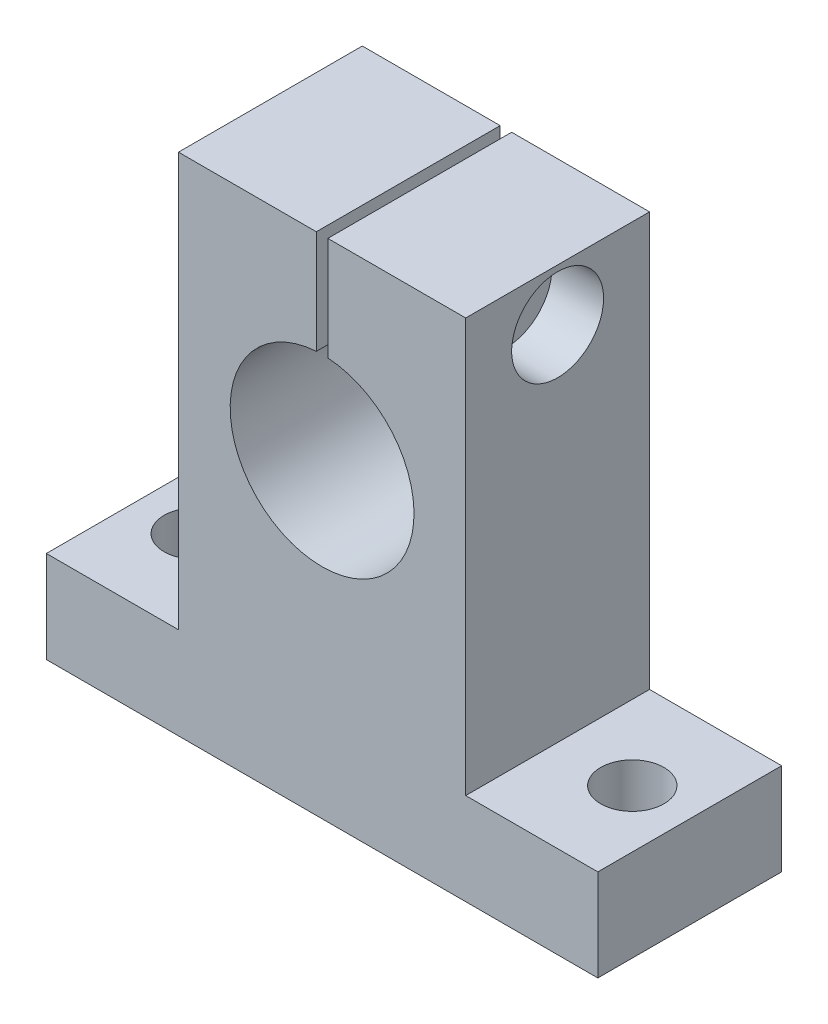
ISO-10303-21;
HEADER;
FILE_DESCRIPTION(('STEP AP214'),'2;1');
FILE_NAME('part.step','',(''),(''),'','','');
FILE_SCHEMA(('AUTOMOTIVE_DESIGN { 1 0 10303 214 1 1 1 1 }'));
ENDSEC;
DATA;
#1=APPLICATION_CONTEXT('core data for automotive mechanical design processes');
#2=APPLICATION_PROTOCOL_DEFINITION('international standard','automotive_design',2000,#1);
#3=PRODUCT_CONTEXT('',#1,'mechanical');
#4=PRODUCT('Part','Part','',(#3));
#5=PRODUCT_RELATED_PRODUCT_CATEGORY('part','',(#4));
#6=PRODUCT_DEFINITION_FORMATION('','',#4);
#7=PRODUCT_DEFINITION_CONTEXT('part definition',#1,'design');
#8=PRODUCT_DEFINITION('design','',#6,#7);
#9=PRODUCT_DEFINITION_SHAPE('','',#8);
#10=(LENGTH_UNIT() NAMED_UNIT(*) SI_UNIT(.MILLI.,.METRE.));
#11=(NAMED_UNIT(*) PLANE_ANGLE_UNIT() SI_UNIT($,.RADIAN.));
#12=(NAMED_UNIT(*) SI_UNIT($,.STERADIAN.) SOLID_ANGLE_UNIT());
#13=UNCERTAINTY_MEASURE_WITH_UNIT(LENGTH_MEASURE(1.E-05),#10,'distance_accuracy_value','');
#14=(GEOMETRIC_REPRESENTATION_CONTEXT(3) GLOBAL_UNCERTAINTY_ASSIGNED_CONTEXT((#13)) GLOBAL_UNIT_ASSIGNED_CONTEXT((#10,
#11,#12)) REPRESENTATION_CONTEXT('',''));
#15=CARTESIAN_POINT('',(0.,0.,0.));
#16=DIRECTION('',(0.,0.,1.));
#17=DIRECTION('',(1.,0.,0.));
#18=AXIS2_PLACEMENT_3D('',#15,#16,#17);
#19=CARTESIAN_POINT('',(32.3020446051646,41.395525782961,8.));
#20=DIRECTION('',(-1.,0.,0.));
#21=DIRECTION('',(0.,0.,1.));
#22=AXIS2_PLACEMENT_3D('',#19,#20,#21);
#23=PLANE('',#22);
#24=CARTESIAN_POINT('',(32.3020446051646,37.395525782961,8.));
#25=DIRECTION('',(1.,0.,0.));
#26=DIRECTION('',(0.,0.,-1.));
#27=AXIS2_PLACEMENT_3D('',#24,#25,#26);
#28=CIRCLE('',#27,2.25);
#29=CARTESIAN_POINT('',(32.3020446051646,37.395525782961,5.74999999999999));
#30=VERTEX_POINT('',#29);
#31=EDGE_CURVE('E112',#30,#30,#28,.F.);
#32=ORIENTED_EDGE('',*,*,#31,.T.);
#33=EDGE_LOOP('',(#32));
#34=FACE_BOUND('',#33,.T.);
#35=CARTESIAN_POINT('',(32.3020446051646,37.395525782961,8.));
#36=DIRECTION('',(1.,0.,0.));
#37=DIRECTION('',(0.,0.,-1.));
#38=AXIS2_PLACEMENT_3D('',#35,#36,#37);
#39=CIRCLE('',#38,4.);
#40=CARTESIAN_POINT('',(32.3020446051646,37.395525782961,4.));
#41=VERTEX_POINT('',#40);
#42=EDGE_CURVE('E19',#41,#41,#39,.T.);
#43=ORIENTED_EDGE('',*,*,#42,.T.);
#44=EDGE_LOOP('',(#43));
#45=FACE_BOUND('',#44,.T.);
#46=ADVANCED_FACE('F16',(#34,#45),#23,.F.);
#47=CARTESIAN_POINT('',(17.8020446051646,37.395525782961,8.00000000000001));
#48=DIRECTION('',(1.,0.,0.));
#49=DIRECTION('',(0.,1.,0.));
#50=AXIS2_PLACEMENT_3D('',#47,#48,#49);
#51=CYLINDRICAL_SURFACE('',#50,1.69999999999999);
#52=CARTESIAN_POINT('',(11.8020446051646,37.395525782961,8.00000000000001));
#53=DIRECTION('',(1.,0.,0.));
#54=DIRECTION('',(0.,1.,0.));
#55=AXIS2_PLACEMENT_3D('',#52,#53,#54);
#56=CIRCLE('',#55,1.69999999999999);
#57=CARTESIAN_POINT('',(11.8020446051646,39.095525782961,8.00000000000001));
#58=VERTEX_POINT('',#57);
#59=EDGE_CURVE('E164',#58,#58,#56,.T.);
#60=ORIENTED_EDGE('',*,*,#59,.F.);
#61=EDGE_LOOP('',(#60));
#62=FACE_BOUND('',#61,.T.);
#63=CARTESIAN_POINT('',(23.8020446051646,37.395525782961,8.00000000000001));
#64=DIRECTION('',(1.,0.,0.));
#65=DIRECTION('',(0.,1.,0.));
#66=AXIS2_PLACEMENT_3D('',#63,#64,#65);
#67=CIRCLE('',#66,1.69999999999999);
#68=CARTESIAN_POINT('',(23.8020446051646,39.095525782961,8.00000000000001));
#69=VERTEX_POINT('',#68);
#70=EDGE_CURVE('E199',#69,#69,#67,.T.);
#71=ORIENTED_EDGE('',*,*,#70,.T.);
#72=EDGE_LOOP('',(#71));
#73=FACE_BOUND('',#72,.T.);
#74=ADVANCED_FACE('F493',(#62,#73),#51,.F.);
#75=CARTESIAN_POINT('',(5.30204460516461,1.90334592729318,8.));
#76=DIRECTION('',(0.,1.,0.));
#77=DIRECTION('',(-1.,0.,0.));
#78=AXIS2_PLACEMENT_3D('',#75,#76,#77);
#79=CYLINDRICAL_SURFACE('',#78,2.75);
#80=CARTESIAN_POINT('',(5.30204460516461,-2.09665407270681,8.));
#81=DIRECTION('',(0.,1.,0.));
#82=DIRECTION('',(-1.,0.,0.));
#83=AXIS2_PLACEMENT_3D('',#80,#81,#82);
#84=CIRCLE('',#83,2.75);
#85=CARTESIAN_POINT('',(2.55204460516461,-2.09665407270681,8.));
#86=VERTEX_POINT('',#85);
#87=EDGE_CURVE('E147',#86,#86,#84,.T.);
#88=ORIENTED_EDGE('',*,*,#87,.F.);
#89=EDGE_LOOP('',(#88));
#90=FACE_BOUND('',#89,.T.);
#91=CARTESIAN_POINT('',(5.30204460516461,5.90334592729318,8.));
#92=DIRECTION('',(0.,1.,0.));
#93=DIRECTION('',(-1.,0.,0.));
#94=AXIS2_PLACEMENT_3D('',#91,#92,#93);
#95=CIRCLE('',#94,2.75);
#96=CARTESIAN_POINT('',(2.55204460516461,5.90334592729318,8.));
#97=VERTEX_POINT('',#96);
#98=EDGE_CURVE('E158',#97,#97,#95,.F.);
#99=ORIENTED_EDGE('',*,*,#98,.F.);
#100=EDGE_LOOP('',(#99));
#101=FACE_BOUND('',#100,.T.);
#102=ADVANCED_FACE('F484',(#90,#101),#79,.F.);
#103=CARTESIAN_POINT('',(43.3020446051646,1.90334592729318,8.));
#104=DIRECTION('',(0.,1.,0.));
#105=DIRECTION('',(0.,0.,1.));
#106=AXIS2_PLACEMENT_3D('',#103,#104,#105);
#107=CYLINDRICAL_SURFACE('',#106,2.75000000000001);
#108=CARTESIAN_POINT('',(43.3020446051646,-2.09665407270681,8.));
#109=DIRECTION('',(0.,1.,0.));
#110=DIRECTION('',(0.,0.,1.));
#111=AXIS2_PLACEMENT_3D('',#108,#109,#110);
#112=CIRCLE('',#111,2.75000000000001);
#113=CARTESIAN_POINT('',(43.3020446051646,-2.09665407270681,10.75));
#114=VERTEX_POINT('',#113);
#115=EDGE_CURVE('E192',#114,#114,#112,.T.);
#116=ORIENTED_EDGE('',*,*,#115,.F.);
#117=EDGE_LOOP('',(#116));
#118=FACE_BOUND('',#117,.T.);
#119=CARTESIAN_POINT('',(43.3020446051646,5.90334592729318,8.));
#120=DIRECTION('',(0.,1.,0.));
#121=DIRECTION('',(0.,0.,1.));
#122=AXIS2_PLACEMENT_3D('',#119,#120,#121);
#123=CIRCLE('',#122,2.75000000000001);
#124=CARTESIAN_POINT('',(43.3020446051646,5.90334592729318,10.75));
#125=VERTEX_POINT('',#124);
#126=EDGE_CURVE('E136',#125,#125,#123,.F.);
#127=ORIENTED_EDGE('',*,*,#126,.F.);
#128=EDGE_LOOP('',(#127));
#129=FACE_BOUND('',#128,.T.);
#130=ADVANCED_FACE('F211',(#118,#129),#107,.F.);
#131=CARTESIAN_POINT('',(34.5520446051646,37.395525782961,8.));
#132=DIRECTION('',(1.,0.,0.));
#133=DIRECTION('',(0.,0.,-1.));
#134=AXIS2_PLACEMENT_3D('',#131,#132,#133);
#135=CYLINDRICAL_SURFACE('',#134,4.);
#136=ORIENTED_EDGE('',*,*,#42,.F.);
#137=EDGE_LOOP('',(#136));
#138=FACE_BOUND('',#137,.T.);
#139=CARTESIAN_POINT('',(36.8020446051646,37.395525782961,8.));
#140=DIRECTION('',(1.,0.,0.));
#141=DIRECTION('',(0.,0.,-1.));
#142=AXIS2_PLACEMENT_3D('',#139,#140,#141);
#143=CIRCLE('',#142,4.);
#144=CARTESIAN_POINT('',(36.8020446051646,37.395525782961,4.));
#145=VERTEX_POINT('',#144);
#146=EDGE_CURVE('E130',#145,#145,#143,.F.);
#147=ORIENTED_EDGE('',*,*,#146,.F.);
#148=EDGE_LOOP('',(#147));
#149=FACE_BOUND('',#148,.T.);
#150=ADVANCED_FACE('F208',(#138,#149),#135,.F.);
#151=CARTESIAN_POINT('',(24.3020446051646,15.4033459272932,16.));
#152=DIRECTION('',(0.,0.,1.));
#153=DIRECTION('',(1.,0.,0.));
#154=AXIS2_PLACEMENT_3D('',#151,#152,#153);
#155=PLANE('',#154);
#156=DIRECTION('',(0.,1.,0.));
#157=VECTOR('',#156,1.);
#158=CARTESIAN_POINT('',(24.8020446051646,41.9033459272932,16.));
#159=LINE('',#158,#157);
#160=CARTESIAN_POINT('',(24.8020446051646,41.9033459272932,16.));
#161=VERTEX_POINT('',#160);
#162=CARTESIAN_POINT('',(24.8020446051646,32.8877056386288,16.));
#163=VERTEX_POINT('',#162);
#164=EDGE_CURVE('E115',#161,#163,#159,.F.);
#165=ORIENTED_EDGE('',*,*,#164,.T.);
#166=CARTESIAN_POINT('',(24.3020446051646,24.9033459272932,16.));
#167=DIRECTION('',(0.,0.,1.));
#168=DIRECTION('',(1.,0.,0.));
#169=AXIS2_PLACEMENT_3D('',#166,#167,#168);
#170=CIRCLE('',#169,8.);
#171=CARTESIAN_POINT('',(23.8020446051646,32.8877056386288,16.));
#172=VERTEX_POINT('',#171);
#173=EDGE_CURVE('E103',#163,#172,#170,.F.);
#174=ORIENTED_EDGE('',*,*,#173,.T.);
#175=DIRECTION('',(0.,1.,0.));
#176=VECTOR('',#175,1.);
#177=CARTESIAN_POINT('',(23.8020446051646,41.9033459272932,16.));
#178=LINE('',#177,#176);
#179=CARTESIAN_POINT('',(23.8020446051646,41.9033459272932,16.));
#180=VERTEX_POINT('',#179);
#181=EDGE_CURVE('E111',#172,#180,#178,.T.);
#182=ORIENTED_EDGE('',*,*,#181,.T.);
#183=DIRECTION('',(1.,0.,0.));
#184=VECTOR('',#183,1.);
#185=CARTESIAN_POINT('',(11.8020446051646,41.9033459272932,16.));
#186=LINE('',#185,#184);
#187=CARTESIAN_POINT('',(11.8020446051646,41.9033459272932,16.));
#188=VERTEX_POINT('',#187);
#189=EDGE_CURVE('E170',#188,#180,#186,.T.);
#190=ORIENTED_EDGE('',*,*,#189,.F.);
#191=DIRECTION('',(0.,1.,0.));
#192=VECTOR('',#191,1.);
#193=CARTESIAN_POINT('',(11.8020446051646,5.90334592729319,16.));
#194=LINE('',#193,#192);
#195=CARTESIAN_POINT('',(11.8020446051646,5.90334592729319,16.));
#196=VERTEX_POINT('',#195);
#197=EDGE_CURVE('E167',#196,#188,#194,.T.);
#198=ORIENTED_EDGE('',*,*,#197,.F.);
#199=DIRECTION('',(1.,0.,0.));
#200=VECTOR('',#199,1.);
#201=CARTESIAN_POINT('',(0.30204460516461,5.90334592729319,16.));
#202=LINE('',#201,#200);
#203=CARTESIAN_POINT('',(0.302044605164612,5.90334592729319,16.));
#204=VERTEX_POINT('',#203);
#205=EDGE_CURVE('E161',#204,#196,#202,.T.);
#206=ORIENTED_EDGE('',*,*,#205,.F.);
#207=DIRECTION('',(0.,1.,0.));
#208=VECTOR('',#207,1.);
#209=CARTESIAN_POINT('',(0.302044605164612,-2.09665407270681,16.));
#210=LINE('',#209,#208);
#211=CARTESIAN_POINT('',(0.302044605164613,-2.09665407270681,16.));
#212=VERTEX_POINT('',#211);
#213=EDGE_CURVE('E156',#212,#204,#210,.T.);
#214=ORIENTED_EDGE('',*,*,#213,.F.);
#215=DIRECTION('',(1.,0.,0.));
#216=VECTOR('',#215,1.);
#217=CARTESIAN_POINT('',(48.3020446051646,-2.09665407270681,16.));
#218=LINE('',#217,#216);
#219=CARTESIAN_POINT('',(48.3020446051646,-2.09665407270681,16.));
#220=VERTEX_POINT('',#219);
#221=EDGE_CURVE('E150',#220,#212,#218,.F.);
#222=ORIENTED_EDGE('',*,*,#221,.F.);
#223=DIRECTION('',(0.,1.,0.));
#224=VECTOR('',#223,1.);
#225=CARTESIAN_POINT('',(48.3020446051646,5.90334592729319,16.));
#226=LINE('',#225,#224);
#227=CARTESIAN_POINT('',(48.3020446051646,5.90334592729319,16.));
#228=VERTEX_POINT('',#227);
#229=EDGE_CURVE('E145',#228,#220,#226,.F.);
#230=ORIENTED_EDGE('',*,*,#229,.F.);
#231=DIRECTION('',(1.,0.,0.));
#232=VECTOR('',#231,1.);
#233=CARTESIAN_POINT('',(36.8020446051646,5.90334592729319,16.));
#234=LINE('',#233,#232);
#235=CARTESIAN_POINT('',(36.8020446051646,5.90334592729319,16.));
#236=VERTEX_POINT('',#235);
#237=EDGE_CURVE('E139',#236,#228,#234,.T.);
#238=ORIENTED_EDGE('',*,*,#237,.F.);
#239=DIRECTION('',(0.,1.,0.));
#240=VECTOR('',#239,1.);
#241=CARTESIAN_POINT('',(36.8020446051646,41.9033459272932,16.));
#242=LINE('',#241,#240);
#243=CARTESIAN_POINT('',(36.8020446051646,41.9033459272932,16.));
#244=VERTEX_POINT('',#243);
#245=EDGE_CURVE('E133',#244,#236,#242,.F.);
#246=ORIENTED_EDGE('',*,*,#245,.F.);
#247=DIRECTION('',(1.,0.,0.));
#248=VECTOR('',#247,1.);
#249=CARTESIAN_POINT('',(11.8020446051646,41.9033459272932,16.));
#250=LINE('',#249,#248);
#251=EDGE_CURVE('E120',#161,#244,#250,.T.);
#252=ORIENTED_EDGE('',*,*,#251,.F.);
#253=EDGE_LOOP('',(#165,#174,#182,#190,#198,#206,#214,#222,#230,#238,#246,#252));
#254=FACE_BOUND('',#253,.T.);
#255=ADVANCED_FACE('F118',(#254),#155,.T.);
#256=CARTESIAN_POINT('',(28.5520446051646,37.395525782961,8.));
#257=DIRECTION('',(1.,0.,0.));
#258=DIRECTION('',(0.,0.,-1.));
#259=AXIS2_PLACEMENT_3D('',#256,#257,#258);
#260=CYLINDRICAL_SURFACE('',#259,2.25);
#261=CARTESIAN_POINT('',(24.8020446051646,37.395525782961,8.));
#262=DIRECTION('',(1.,0.,0.));
#263=DIRECTION('',(0.,0.,-1.));
#264=AXIS2_PLACEMENT_3D('',#261,#262,#263);
#265=CIRCLE('',#264,2.25);
#266=CARTESIAN_POINT('',(24.8020446051646,37.395525782961,5.74999999999999));
#267=VERTEX_POINT('',#266);
#268=EDGE_CURVE('E116',#267,#267,#265,.F.);
#269=ORIENTED_EDGE('',*,*,#268,.T.);
#270=EDGE_LOOP('',(#269));
#271=FACE_BOUND('',#270,.T.);
#272=ORIENTED_EDGE('',*,*,#31,.F.);
#273=EDGE_LOOP('',(#272));
#274=FACE_BOUND('',#273,.T.);
#275=ADVANCED_FACE('F456',(#271,#274),#260,.F.);
#276=CARTESIAN_POINT('',(24.3020446051646,24.9033459272932,0.));
#277=DIRECTION('',(0.,0.,1.));
#278=DIRECTION('',(1.,0.,0.));
#279=AXIS2_PLACEMENT_3D('',#276,#277,#278);
#280=CYLINDRICAL_SURFACE('',#279,8.);
#281=DIRECTION('',(0.,0.,-1.));
#282=VECTOR('',#281,1.);
#283=CARTESIAN_POINT('',(24.8020446051646,32.8877056386288,16.));
#284=LINE('',#283,#282);
#285=CARTESIAN_POINT('',(24.8020446051646,32.8877056386288,0.));
#286=VERTEX_POINT('',#285);
#287=EDGE_CURVE('E107',#163,#286,#284,.T.);
#288=ORIENTED_EDGE('',*,*,#287,.T.);
#289=CARTESIAN_POINT('',(24.3020446051646,24.9033459272932,0.));
#290=DIRECTION('',(0.,0.,1.));
#291=DIRECTION('',(1.,0.,0.));
#292=AXIS2_PLACEMENT_3D('',#289,#290,#291);
#293=CIRCLE('',#292,8.);
#294=CARTESIAN_POINT('',(23.8020446051646,32.8877056386288,0.));
#295=VERTEX_POINT('',#294);
#296=EDGE_CURVE('E181',#286,#295,#293,.F.);
#297=ORIENTED_EDGE('',*,*,#296,.T.);
#298=DIRECTION('',(0.,0.,1.));
#299=VECTOR('',#298,1.);
#300=CARTESIAN_POINT('',(23.8020446051646,32.8877056386288,0.));
#301=LINE('',#300,#299);
#302=EDGE_CURVE('E108',#295,#172,#301,.T.);
#303=ORIENTED_EDGE('',*,*,#302,.T.);
#304=ORIENTED_EDGE('',*,*,#173,.F.);
#305=EDGE_LOOP('',(#288,#297,#303,#304));
#306=FACE_BOUND('',#305,.T.);
#307=ADVANCED_FACE('F105',(#306),#280,.F.);
#308=CARTESIAN_POINT('',(23.8020446051646,41.9033459272932,0.));
#309=DIRECTION('',(-1.,0.,0.));
#310=DIRECTION('',(0.,0.,1.));
#311=AXIS2_PLACEMENT_3D('',#308,#309,#310);
#312=PLANE('',#311);
#313=ORIENTED_EDGE('',*,*,#70,.F.);
#314=EDGE_LOOP('',(#313));
#315=FACE_BOUND('',#314,.T.);
#316=DIRECTION('',(0.,1.,0.));
#317=VECTOR('',#316,1.);
#318=CARTESIAN_POINT('',(23.8020446051646,15.4033459272932,0.));
#319=LINE('',#318,#317);
#320=CARTESIAN_POINT('',(23.8020446051646,41.9033459272932,0.));
#321=VERTEX_POINT('',#320);
#322=EDGE_CURVE('E183',#295,#321,#319,.T.);
#323=ORIENTED_EDGE('',*,*,#322,.T.);
#324=DIRECTION('',(0.,0.,1.));
#325=VECTOR('',#324,1.);
#326=CARTESIAN_POINT('',(23.8020446051646,41.9033459272932,0.));
#327=LINE('',#326,#325);
#328=EDGE_CURVE('E175',#180,#321,#327,.F.);
#329=ORIENTED_EDGE('',*,*,#328,.F.);
#330=ORIENTED_EDGE('',*,*,#181,.F.);
#331=ORIENTED_EDGE('',*,*,#302,.F.);
#332=EDGE_LOOP('',(#323,#329,#330,#331));
#333=FACE_BOUND('',#332,.T.);
#334=ADVANCED_FACE('F308',(#315,#333),#312,.F.);
#335=CARTESIAN_POINT('',(11.8020446051646,41.9033459272932,0.));
#336=DIRECTION('',(0.,1.,0.));
#337=DIRECTION('',(0.,0.,1.));
#338=AXIS2_PLACEMENT_3D('',#335,#336,#337);
#339=PLANE('',#338);
#340=DIRECTION('',(0.,0.,1.));
#341=VECTOR('',#340,1.);
#342=CARTESIAN_POINT('',(11.8020446051646,41.9033459272932,0.));
#343=LINE('',#342,#341);
#344=CARTESIAN_POINT('',(11.8020446051646,41.9033459272932,0.));
#345=VERTEX_POINT('',#344);
#346=EDGE_CURVE('E169',#188,#345,#343,.F.);
#347=ORIENTED_EDGE('',*,*,#346,.F.);
#348=ORIENTED_EDGE('',*,*,#189,.T.);
#349=ORIENTED_EDGE('',*,*,#328,.T.);
#350=DIRECTION('',(1.,0.,0.));
#351=VECTOR('',#350,1.);
#352=CARTESIAN_POINT('',(24.3020446051646,41.9033459272932,0.));
#353=LINE('',#352,#351);
#354=EDGE_CURVE('E284',#321,#345,#353,.F.);
#355=ORIENTED_EDGE('',*,*,#354,.T.);
#356=EDGE_LOOP('',(#347,#348,#349,#355));
#357=FACE_BOUND('',#356,.T.);
#358=ADVANCED_FACE('F299',(#357),#339,.T.);
#359=CARTESIAN_POINT('',(11.8020446051646,5.90334592729319,0.));
#360=DIRECTION('',(-1.,0.,0.));
#361=DIRECTION('',(0.,0.,1.));
#362=AXIS2_PLACEMENT_3D('',#359,#360,#361);
#363=PLANE('',#362);
#364=ORIENTED_EDGE('',*,*,#59,.T.);
#365=EDGE_LOOP('',(#364));
#366=FACE_BOUND('',#365,.T.);
#367=DIRECTION('',(0.,1.,0.));
#368=VECTOR('',#367,1.);
#369=CARTESIAN_POINT('',(11.8020446051646,15.4033459272932,0.));
#370=LINE('',#369,#368);
#371=CARTESIAN_POINT('',(11.8020446051646,5.90334592729319,0.));
#372=VERTEX_POINT('',#371);
#373=EDGE_CURVE('E276',#345,#372,#370,.F.);
#374=ORIENTED_EDGE('',*,*,#373,.T.);
#375=DIRECTION('',(0.,0.,1.));
#376=VECTOR('',#375,1.);
#377=CARTESIAN_POINT('',(11.8020446051646,5.90334592729319,0.));
#378=LINE('',#377,#376);
#379=EDGE_CURVE('E163',#196,#372,#378,.F.);
#380=ORIENTED_EDGE('',*,*,#379,.F.);
#381=ORIENTED_EDGE('',*,*,#197,.T.);
#382=ORIENTED_EDGE('',*,*,#346,.T.);
#383=EDGE_LOOP('',(#374,#380,#381,#382));
#384=FACE_BOUND('',#383,.T.);
#385=ADVANCED_FACE('F343',(#366,#384),#363,.T.);
#386=CARTESIAN_POINT('',(0.30204460516461,5.90334592729319,0.));
#387=DIRECTION('',(0.,1.,0.));
#388=DIRECTION('',(0.,0.,1.));
#389=AXIS2_PLACEMENT_3D('',#386,#387,#388);
#390=PLANE('',#389);
#391=ORIENTED_EDGE('',*,*,#98,.T.);
#392=EDGE_LOOP('',(#391));
#393=FACE_BOUND('',#392,.T.);
#394=DIRECTION('',(1.,0.,0.));
#395=VECTOR('',#394,1.);
#396=CARTESIAN_POINT('',(24.3020446051646,5.90334592729319,0.));
#397=LINE('',#396,#395);
#398=CARTESIAN_POINT('',(0.302044605164611,5.90334592729319,0.));
#399=VERTEX_POINT('',#398);
#400=EDGE_CURVE('E268',#372,#399,#397,.F.);
#401=ORIENTED_EDGE('',*,*,#400,.T.);
#402=DIRECTION('',(0.,0.,1.));
#403=VECTOR('',#402,1.);
#404=CARTESIAN_POINT('',(0.302044605164612,5.90334592729319,0.));
#405=LINE('',#404,#403);
#406=EDGE_CURVE('E153',#204,#399,#405,.F.);
#407=ORIENTED_EDGE('',*,*,#406,.F.);
#408=ORIENTED_EDGE('',*,*,#205,.T.);
#409=ORIENTED_EDGE('',*,*,#379,.T.);
#410=EDGE_LOOP('',(#401,#407,#408,#409));
#411=FACE_BOUND('',#410,.T.);
#412=ADVANCED_FACE('F339',(#393,#411),#390,.T.);
#413=CARTESIAN_POINT('',(0.302044605164612,-2.09665407270681,0.));
#414=DIRECTION('',(-1.,0.,0.));
#415=DIRECTION('',(0.,0.,1.));
#416=AXIS2_PLACEMENT_3D('',#413,#414,#415);
#417=PLANE('',#416);
#418=DIRECTION('',(0.,1.,0.));
#419=VECTOR('',#418,1.);
#420=CARTESIAN_POINT('',(0.302044605164611,15.4033459272932,0.));
#421=LINE('',#420,#419);
#422=CARTESIAN_POINT('',(0.302044605164612,-2.09665407270681,0.));
#423=VERTEX_POINT('',#422);
#424=EDGE_CURVE('E260',#399,#423,#421,.F.);
#425=ORIENTED_EDGE('',*,*,#424,.T.);
#426=DIRECTION('',(0.,0.,-1.));
#427=VECTOR('',#426,1.);
#428=CARTESIAN_POINT('',(0.302044605164614,-2.09665407270681,0.));
#429=LINE('',#428,#427);
#430=EDGE_CURVE('E152',#212,#423,#429,.T.);
#431=ORIENTED_EDGE('',*,*,#430,.F.);
#432=ORIENTED_EDGE('',*,*,#213,.T.);
#433=ORIENTED_EDGE('',*,*,#406,.T.);
#434=EDGE_LOOP('',(#425,#431,#432,#433));
#435=FACE_BOUND('',#434,.T.);
#436=ADVANCED_FACE('F335',(#435),#417,.T.);
#437=CARTESIAN_POINT('',(48.3020446051646,-2.09665407270681,0.));
#438=DIRECTION('',(0.,-1.,0.));
#439=DIRECTION('',(0.,0.,-1.));
#440=AXIS2_PLACEMENT_3D('',#437,#438,#439);
#441=PLANE('',#440);
#442=ORIENTED_EDGE('',*,*,#87,.T.);
#443=EDGE_LOOP('',(#442));
#444=FACE_BOUND('',#443,.T.);
#445=ORIENTED_EDGE('',*,*,#115,.T.);
#446=EDGE_LOOP('',(#445));
#447=FACE_BOUND('',#446,.T.);
#448=DIRECTION('',(1.,0.,0.));
#449=VECTOR('',#448,1.);
#450=CARTESIAN_POINT('',(24.3020446051646,-2.09665407270681,0.));
#451=LINE('',#450,#449);
#452=CARTESIAN_POINT('',(48.3020446051646,-2.09665407270681,0.));
#453=VERTEX_POINT('',#452);
#454=EDGE_CURVE('E252',#423,#453,#451,.T.);
#455=ORIENTED_EDGE('',*,*,#454,.T.);
#456=DIRECTION('',(0.,0.,-1.));
#457=VECTOR('',#456,1.);
#458=CARTESIAN_POINT('',(48.3020446051646,-2.09665407270681,0.));
#459=LINE('',#458,#457);
#460=EDGE_CURVE('E142',#220,#453,#459,.T.);
#461=ORIENTED_EDGE('',*,*,#460,.F.);
#462=ORIENTED_EDGE('',*,*,#221,.T.);
#463=ORIENTED_EDGE('',*,*,#430,.T.);
#464=EDGE_LOOP('',(#455,#461,#462,#463));
#465=FACE_BOUND('',#464,.T.);
#466=ADVANCED_FACE('F330',(#444,#447,#465),#441,.T.);
#467=CARTESIAN_POINT('',(48.3020446051646,5.90334592729319,0.));
#468=DIRECTION('',(1.,0.,0.));
#469=DIRECTION('',(0.,0.,-1.));
#470=AXIS2_PLACEMENT_3D('',#467,#468,#469);
#471=PLANE('',#470);
#472=DIRECTION('',(0.,1.,0.));
#473=VECTOR('',#472,1.);
#474=CARTESIAN_POINT('',(48.3020446051646,15.4033459272932,0.));
#475=LINE('',#474,#473);
#476=CARTESIAN_POINT('',(48.3020446051646,5.90334592729319,0.));
#477=VERTEX_POINT('',#476);
#478=EDGE_CURVE('E234',#453,#477,#475,.T.);
#479=ORIENTED_EDGE('',*,*,#478,.T.);
#480=DIRECTION('',(0.,0.,1.));
#481=VECTOR('',#480,1.);
#482=CARTESIAN_POINT('',(48.3020446051646,5.90334592729319,0.));
#483=LINE('',#482,#481);
#484=EDGE_CURVE('E141',#228,#477,#483,.F.);
#485=ORIENTED_EDGE('',*,*,#484,.F.);
#486=ORIENTED_EDGE('',*,*,#229,.T.);
#487=ORIENTED_EDGE('',*,*,#460,.T.);
#488=EDGE_LOOP('',(#479,#485,#486,#487));
#489=FACE_BOUND('',#488,.T.);
#490=ADVANCED_FACE('F327',(#489),#471,.T.);
#491=CARTESIAN_POINT('',(36.8020446051646,5.90334592729319,0.));
#492=DIRECTION('',(0.,1.,0.));
#493=DIRECTION('',(0.,0.,1.));
#494=AXIS2_PLACEMENT_3D('',#491,#492,#493);
#495=PLANE('',#494);
#496=ORIENTED_EDGE('',*,*,#126,.T.);
#497=EDGE_LOOP('',(#496));
#498=FACE_BOUND('',#497,.T.);
#499=DIRECTION('',(1.,0.,0.));
#500=VECTOR('',#499,1.);
#501=CARTESIAN_POINT('',(24.3020446051646,5.90334592729319,0.));
#502=LINE('',#501,#500);
#503=CARTESIAN_POINT('',(36.8020446051646,5.90334592729319,0.));
#504=VERTEX_POINT('',#503);
#505=EDGE_CURVE('E230',#477,#504,#502,.F.);
#506=ORIENTED_EDGE('',*,*,#505,.T.);
#507=DIRECTION('',(0.,0.,-1.));
#508=VECTOR('',#507,1.);
#509=CARTESIAN_POINT('',(36.8020446051646,5.90334592729319,0.));
#510=LINE('',#509,#508);
#511=EDGE_CURVE('E135',#236,#504,#510,.T.);
#512=ORIENTED_EDGE('',*,*,#511,.F.);
#513=ORIENTED_EDGE('',*,*,#237,.T.);
#514=ORIENTED_EDGE('',*,*,#484,.T.);
#515=EDGE_LOOP('',(#506,#512,#513,#514));
#516=FACE_BOUND('',#515,.T.);
#517=ADVANCED_FACE('F219',(#498,#516),#495,.T.);
#518=CARTESIAN_POINT('',(36.8020446051646,41.9033459272932,0.));
#519=DIRECTION('',(1.,0.,0.));
#520=DIRECTION('',(0.,0.,-1.));
#521=AXIS2_PLACEMENT_3D('',#518,#519,#520);
#522=PLANE('',#521);
#523=ORIENTED_EDGE('',*,*,#146,.T.);
#524=EDGE_LOOP('',(#523));
#525=FACE_BOUND('',#524,.T.);
#526=DIRECTION('',(0.,1.,0.));
#527=VECTOR('',#526,1.);
#528=CARTESIAN_POINT('',(36.8020446051646,15.4033459272932,0.));
#529=LINE('',#528,#527);
#530=CARTESIAN_POINT('',(36.8020446051646,41.9033459272932,0.));
#531=VERTEX_POINT('',#530);
#532=EDGE_CURVE('E224',#504,#531,#529,.T.);
#533=ORIENTED_EDGE('',*,*,#532,.T.);
#534=DIRECTION('',(0.,0.,1.));
#535=VECTOR('',#534,1.);
#536=CARTESIAN_POINT('',(36.8020446051646,41.9033459272932,0.));
#537=LINE('',#536,#535);
#538=EDGE_CURVE('E122',#244,#531,#537,.F.);
#539=ORIENTED_EDGE('',*,*,#538,.F.);
#540=ORIENTED_EDGE('',*,*,#245,.T.);
#541=ORIENTED_EDGE('',*,*,#511,.T.);
#542=EDGE_LOOP('',(#533,#539,#540,#541));
#543=FACE_BOUND('',#542,.T.);
#544=ADVANCED_FACE('F215',(#525,#543),#522,.T.);
#545=CARTESIAN_POINT('',(11.8020446051646,41.9033459272932,0.));
#546=DIRECTION('',(0.,1.,0.));
#547=DIRECTION('',(0.,0.,1.));
#548=AXIS2_PLACEMENT_3D('',#545,#546,#547);
#549=PLANE('',#548);
#550=ORIENTED_EDGE('',*,*,#538,.T.);
#551=DIRECTION('',(1.,0.,0.));
#552=VECTOR('',#551,1.);
#553=CARTESIAN_POINT('',(24.3020446051646,41.9033459272932,0.));
#554=LINE('',#553,#552);
#555=CARTESIAN_POINT('',(24.8020446051646,41.9033459272932,0.));
#556=VERTEX_POINT('',#555);
#557=EDGE_CURVE('E25',#531,#556,#554,.F.);
#558=ORIENTED_EDGE('',*,*,#557,.T.);
#559=DIRECTION('',(0.,0.,-1.));
#560=VECTOR('',#559,1.);
#561=CARTESIAN_POINT('',(24.8020446051646,41.9033459272932,16.));
#562=LINE('',#561,#560);
#563=EDGE_CURVE('E33',#556,#161,#562,.F.);
#564=ORIENTED_EDGE('',*,*,#563,.T.);
#565=ORIENTED_EDGE('',*,*,#251,.T.);
#566=EDGE_LOOP('',(#550,#558,#564,#565));
#567=FACE_BOUND('',#566,.T.);
#568=ADVANCED_FACE('F218',(#567),#549,.T.);
#569=CARTESIAN_POINT('',(24.8020446051646,41.9033459272932,16.));
#570=DIRECTION('',(1.,0.,0.));
#571=DIRECTION('',(0.,0.,-1.));
#572=AXIS2_PLACEMENT_3D('',#569,#570,#571);
#573=PLANE('',#572);
#574=ORIENTED_EDGE('',*,*,#268,.F.);
#575=EDGE_LOOP('',(#574));
#576=FACE_BOUND('',#575,.T.);
#577=ORIENTED_EDGE('',*,*,#164,.F.);
#578=ORIENTED_EDGE('',*,*,#563,.F.);
#579=DIRECTION('',(0.,1.,0.));
#580=VECTOR('',#579,1.);
#581=CARTESIAN_POINT('',(24.8020446051646,15.4033459272932,0.));
#582=LINE('',#581,#580);
#583=EDGE_CURVE('E10',#556,#286,#582,.F.);
#584=ORIENTED_EDGE('',*,*,#583,.T.);
#585=ORIENTED_EDGE('',*,*,#287,.F.);
#586=EDGE_LOOP('',(#577,#578,#584,#585));
#587=FACE_BOUND('',#586,.T.);
#588=ADVANCED_FACE('F114',(#576,#587),#573,.F.);
#589=CARTESIAN_POINT('',(24.3020446051646,15.4033459272932,0.));
#590=DIRECTION('',(0.,0.,1.));
#591=DIRECTION('',(1.,0.,0.));
#592=AXIS2_PLACEMENT_3D('',#589,#590,#591);
#593=PLANE('',#592);
#594=ORIENTED_EDGE('',*,*,#557,.F.);
#595=ORIENTED_EDGE('',*,*,#532,.F.);
#596=ORIENTED_EDGE('',*,*,#505,.F.);
#597=ORIENTED_EDGE('',*,*,#478,.F.);
#598=ORIENTED_EDGE('',*,*,#454,.F.);
#599=ORIENTED_EDGE('',*,*,#424,.F.);
#600=ORIENTED_EDGE('',*,*,#400,.F.);
#601=ORIENTED_EDGE('',*,*,#373,.F.);
#602=ORIENTED_EDGE('',*,*,#354,.F.);
#603=ORIENTED_EDGE('',*,*,#322,.F.);
#604=ORIENTED_EDGE('',*,*,#296,.F.);
#605=ORIENTED_EDGE('',*,*,#583,.F.);
#606=EDGE_LOOP('',(#594,#595,#596,#597,#598,#599,#600,#601,#602,#603,#604,#605));
#607=FACE_BOUND('',#606,.T.);
#608=ADVANCED_FACE('F306',(#607),#593,.F.);
#609=CLOSED_SHELL('',(#46,#74,#102,#130,#150,#255,#275,#307,#334,#358,#385,#412,#436,#466,#490,
#517,#544,#568,#588,#608));
#610=MANIFOLD_SOLID_BREP('B1',#609);
#611=ADVANCED_BREP_SHAPE_REPRESENTATION('',(#18,#610),#14);
#612=SHAPE_DEFINITION_REPRESENTATION(#9,#611);
ENDSEC;
END-ISO-10303-21;
